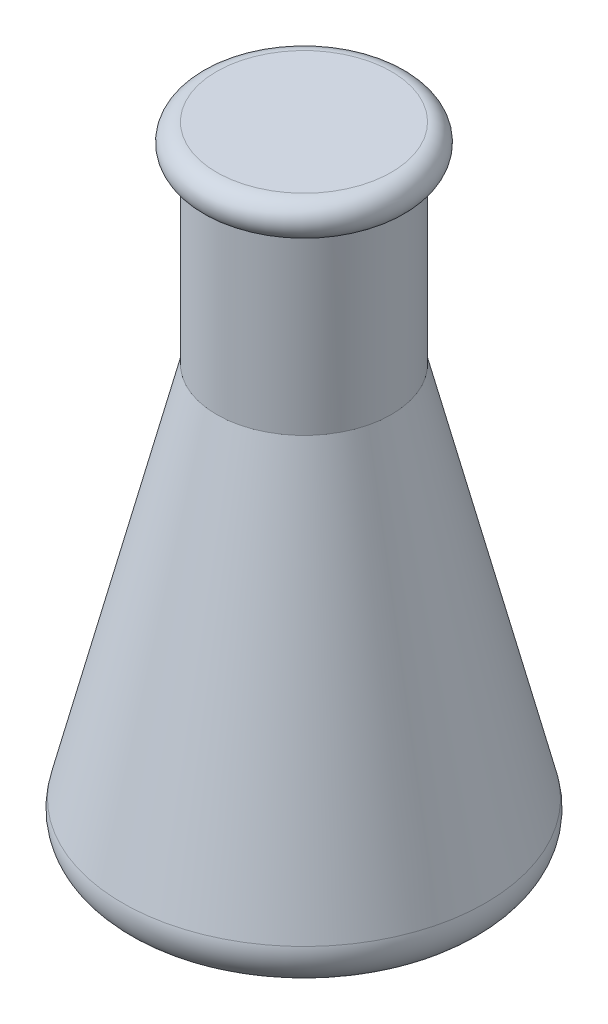
ISO-10303-21;
HEADER;
FILE_DESCRIPTION(('STEP AP214'),'2;1');
FILE_NAME('part.step','',(''),(''),'','','');
FILE_SCHEMA(('AUTOMOTIVE_DESIGN { 1 0 10303 214 1 1 1 1 }'));
ENDSEC;
DATA;
#1=APPLICATION_CONTEXT('core data for automotive mechanical design processes');
#2=APPLICATION_PROTOCOL_DEFINITION('international standard','automotive_design',2000,#1);
#3=PRODUCT_CONTEXT('',#1,'mechanical');
#4=PRODUCT('Part','Part','',(#3));
#5=PRODUCT_RELATED_PRODUCT_CATEGORY('part','',(#4));
#6=PRODUCT_DEFINITION_FORMATION('','',#4);
#7=PRODUCT_DEFINITION_CONTEXT('part definition',#1,'design');
#8=PRODUCT_DEFINITION('design','',#6,#7);
#9=PRODUCT_DEFINITION_SHAPE('','',#8);
#10=(LENGTH_UNIT() NAMED_UNIT(*) SI_UNIT(.MILLI.,.METRE.));
#11=(NAMED_UNIT(*) PLANE_ANGLE_UNIT() SI_UNIT($,.RADIAN.));
#12=(NAMED_UNIT(*) SI_UNIT($,.STERADIAN.) SOLID_ANGLE_UNIT());
#13=UNCERTAINTY_MEASURE_WITH_UNIT(LENGTH_MEASURE(1.E-05),#10,'distance_accuracy_value','');
#14=(GEOMETRIC_REPRESENTATION_CONTEXT(3) GLOBAL_UNCERTAINTY_ASSIGNED_CONTEXT((#13)) GLOBAL_UNIT_ASSIGNED_CONTEXT((#10,
#11,#12)) REPRESENTATION_CONTEXT('',''));
#15=CARTESIAN_POINT('',(0.,0.,0.));
#16=DIRECTION('',(0.,0.,1.));
#17=DIRECTION('',(1.,0.,0.));
#18=AXIS2_PLACEMENT_3D('',#15,#16,#17);
#19=CARTESIAN_POINT('',(0.,9.,0.));
#20=DIRECTION('',(0.,-1.,0.));
#21=DIRECTION('',(1.,0.,0.));
#22=AXIS2_PLACEMENT_3D('',#19,#20,#21);
#23=CONICAL_SURFACE('',#22,7.50000000000001,0.244978663126864);
#24=CARTESIAN_POINT('',(0.,-23.272393124891,0.));
#25=DIRECTION('',(0.,-1.,0.));
#26=DIRECTION('',(1.,0.,0.));
#27=AXIS2_PLACEMENT_3D('',#24,#25,#26);
#28=CIRCLE('',#27,15.5680982812228);
#29=CARTESIAN_POINT('',(15.5680982812228,-23.272393124891,0.));
#30=VERTEX_POINT('',#29);
#31=EDGE_CURVE('E49',#30,#30,#28,.F.);
#32=ORIENTED_EDGE('',*,*,#31,.T.);
#33=EDGE_LOOP('',(#32));
#34=FACE_BOUND('',#33,.T.);
#35=CARTESIAN_POINT('',(0.,9.,0.));
#36=DIRECTION('',(0.,1.,0.));
#37=DIRECTION('',(-1.,0.,0.));
#38=AXIS2_PLACEMENT_3D('',#35,#36,#37);
#39=CIRCLE('',#38,7.50000000000001);
#40=CARTESIAN_POINT('',(-7.50000000000001,9.,0.));
#41=VERTEX_POINT('',#40);
#42=EDGE_CURVE('E54',#41,#41,#39,.T.);
#43=ORIENTED_EDGE('',*,*,#42,.F.);
#44=EDGE_LOOP('',(#43));
#45=FACE_BOUND('',#44,.T.);
#46=ADVANCED_FACE('F41',(#34,#45),#23,.T.);
#47=CARTESIAN_POINT('',(0.,41.4229181027336,0.));
#48=DIRECTION('',(0.,1.,0.));
#49=DIRECTION('',(-1.,0.,0.));
#50=AXIS2_PLACEMENT_3D('',#47,#48,#49);
#51=CYLINDRICAL_SURFACE('',#50,7.50000000000001);
#52=ORIENTED_EDGE('',*,*,#42,.T.);
#53=EDGE_LOOP('',(#52));
#54=FACE_BOUND('',#53,.T.);
#55=CARTESIAN_POINT('',(0.,24.,0.));
#56=DIRECTION('',(0.,1.,0.));
#57=DIRECTION('',(-1.,0.,0.));
#58=AXIS2_PLACEMENT_3D('',#55,#56,#57);
#59=CIRCLE('',#58,7.50000000000001);
#60=CARTESIAN_POINT('',(-7.50000000000001,24.,0.));
#61=VERTEX_POINT('',#60);
#62=EDGE_CURVE('E59',#61,#61,#59,.T.);
#63=ORIENTED_EDGE('',*,*,#62,.F.);
#64=EDGE_LOOP('',(#63));
#65=FACE_BOUND('',#64,.T.);
#66=ADVANCED_FACE('F75',(#54,#65),#51,.T.);
#67=CARTESIAN_POINT('',(0.,25.5,0.));
#68=DIRECTION('',(0.,1.,0.));
#69=DIRECTION('',(-1.,0.,0.));
#70=AXIS2_PLACEMENT_3D('',#67,#68,#69);
#71=TOROIDAL_SURFACE('',#70,7.5102050558912,1.50003471398689);
#72=CARTESIAN_POINT('',(0.,27.,0.));
#73=DIRECTION('',(0.,1.,0.));
#74=DIRECTION('',(-1.,0.,0.));
#75=AXIS2_PLACEMENT_3D('',#72,#73,#74);
#76=CIRCLE('',#75,7.50000000000001);
#77=CARTESIAN_POINT('',(-7.50000000000001,27.,0.));
#78=VERTEX_POINT('',#77);
#79=EDGE_CURVE('E65',#78,#78,#76,.T.);
#80=ORIENTED_EDGE('',*,*,#79,.F.);
#81=EDGE_LOOP('',(#80));
#82=FACE_BOUND('',#81,.T.);
#83=ORIENTED_EDGE('',*,*,#62,.T.);
#84=EDGE_LOOP('',(#83));
#85=FACE_BOUND('',#84,.T.);
#86=ADVANCED_FACE('F72',(#82,#85),#71,.T.);
#87=CARTESIAN_POINT('',(0.,27.,0.));
#88=DIRECTION('',(0.,1.,0.));
#89=DIRECTION('',(-1.,0.,0.));
#90=AXIS2_PLACEMENT_3D('',#87,#88,#89);
#91=PLANE('',#90);
#92=ORIENTED_EDGE('',*,*,#79,.T.);
#93=EDGE_LOOP('',(#92));
#94=FACE_BOUND('',#93,.T.);
#95=ADVANCED_FACE('F70',(#94),#91,.T.);
#96=CARTESIAN_POINT('',(0.,-27.,0.));
#97=DIRECTION('',(0.,1.,0.));
#98=DIRECTION('',(-1.,0.,0.));
#99=AXIS2_PLACEMENT_3D('',#96,#97,#98);
#100=PLANE('',#99);
#101=CARTESIAN_POINT('',(0.,-27.,0.));
#102=DIRECTION('',(0.,1.,0.));
#103=DIRECTION('',(-1.,0.,0.));
#104=AXIS2_PLACEMENT_3D('',#101,#102,#103);
#105=CIRCLE('',#104,12.6576707807868);
#106=CARTESIAN_POINT('',(-12.6576707807868,-27.,0.));
#107=VERTEX_POINT('',#106);
#108=EDGE_CURVE('E10',#107,#107,#105,.F.);
#109=ORIENTED_EDGE('',*,*,#108,.T.);
#110=EDGE_LOOP('',(#109));
#111=FACE_BOUND('',#110,.T.);
#112=ADVANCED_FACE('F88',(#111),#100,.F.);
#113=CARTESIAN_POINT('',(0.,-24.,0.));
#114=DIRECTION('',(0.,1.,0.));
#115=DIRECTION('',(-1.,0.,0.));
#116=AXIS2_PLACEMENT_3D('',#113,#114,#115);
#117=TOROIDAL_SURFACE('',#116,12.6576707807868,3.);
#118=ORIENTED_EDGE('',*,*,#108,.F.);
#119=EDGE_LOOP('',(#118));
#120=FACE_BOUND('',#119,.T.);
#121=ORIENTED_EDGE('',*,*,#31,.F.);
#122=EDGE_LOOP('',(#121));
#123=FACE_BOUND('',#122,.T.);
#124=ADVANCED_FACE('F43',(#120,#123),#117,.T.);
#125=CLOSED_SHELL('',(#46,#66,#86,#95,#112,#124));
#126=MANIFOLD_SOLID_BREP('B2',#125);
#127=ADVANCED_BREP_SHAPE_REPRESENTATION('',(#18,#126),#14);
#128=SHAPE_DEFINITION_REPRESENTATION(#9,#127);
ENDSEC;
END-ISO-10303-21;
